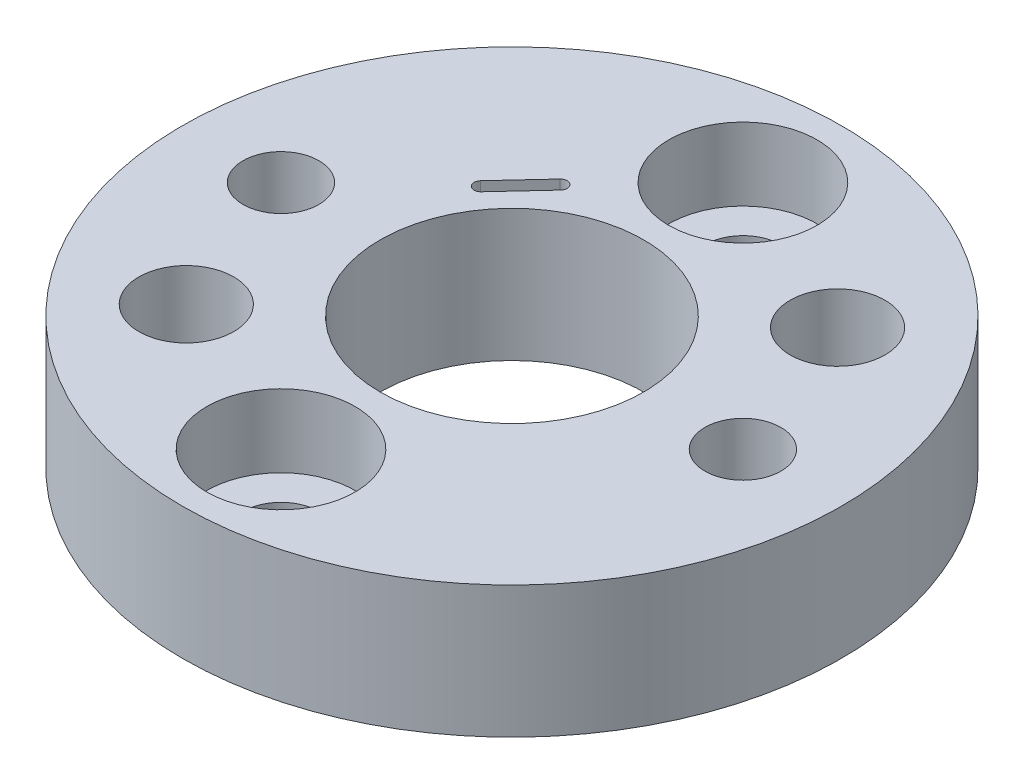
ISO-10303-21;
HEADER;
FILE_DESCRIPTION(('STEP AP214'),'2;1');
FILE_NAME('part.step','',(''),(''),'','','');
FILE_SCHEMA(('AUTOMOTIVE_DESIGN { 1 0 10303 214 1 1 1 1 }'));
ENDSEC;
DATA;
#1=APPLICATION_CONTEXT('core data for automotive mechanical design processes');
#2=APPLICATION_PROTOCOL_DEFINITION('international standard','automotive_design',2000,#1);
#3=PRODUCT_CONTEXT('',#1,'mechanical');
#4=PRODUCT('Part','Part','',(#3));
#5=PRODUCT_RELATED_PRODUCT_CATEGORY('part','',(#4));
#6=PRODUCT_DEFINITION_FORMATION('','',#4);
#7=PRODUCT_DEFINITION_CONTEXT('part definition',#1,'design');
#8=PRODUCT_DEFINITION('design','',#6,#7);
#9=PRODUCT_DEFINITION_SHAPE('','',#8);
#10=(LENGTH_UNIT() NAMED_UNIT(*) SI_UNIT(.MILLI.,.METRE.));
#11=(NAMED_UNIT(*) PLANE_ANGLE_UNIT() SI_UNIT($,.RADIAN.));
#12=(NAMED_UNIT(*) SI_UNIT($,.STERADIAN.) SOLID_ANGLE_UNIT());
#13=UNCERTAINTY_MEASURE_WITH_UNIT(LENGTH_MEASURE(1.E-05),#10,'distance_accuracy_value','');
#14=(GEOMETRIC_REPRESENTATION_CONTEXT(3) GLOBAL_UNCERTAINTY_ASSIGNED_CONTEXT((#13)) GLOBAL_UNIT_ASSIGNED_CONTEXT((#10,
#11,#12)) REPRESENTATION_CONTEXT('',''));
#15=CARTESIAN_POINT('',(0.,0.,0.));
#16=DIRECTION('',(0.,0.,1.));
#17=DIRECTION('',(1.,0.,0.));
#18=AXIS2_PLACEMENT_3D('',#15,#16,#17);
#19=CARTESIAN_POINT('',(0.,6.35,0.));
#20=DIRECTION('',(0.,1.,0.));
#21=DIRECTION('',(0.,0.,1.));
#22=AXIS2_PLACEMENT_3D('',#19,#20,#21);
#23=PLANE('',#22);
#24=CARTESIAN_POINT('',(-11.1252,6.34999999999999,0.));
#25=DIRECTION('',(0.,-1.,0.));
#26=DIRECTION('',(0.,0.,-1.));
#27=AXIS2_PLACEMENT_3D('',#24,#25,#26);
#28=CIRCLE('',#27,1.82880000000001);
#29=CARTESIAN_POINT('',(-11.1252,6.34999999999999,-1.82880000000001));
#30=VERTEX_POINT('',#29);
#31=EDGE_CURVE('E285',#30,#30,#28,.T.);
#32=ORIENTED_EDGE('',*,*,#31,.T.);
#33=EDGE_LOOP('',(#32));
#34=FACE_BOUND('',#33,.T.);
#35=CARTESIAN_POINT('',(0.,6.35,11.1252));
#36=DIRECTION('',(0.,1.,0.));
#37=DIRECTION('',(0.,0.,1.));
#38=AXIS2_PLACEMENT_3D('',#35,#36,#37);
#39=CIRCLE('',#38,3.57251);
#40=CARTESIAN_POINT('',(0.,6.35,14.69771));
#41=VERTEX_POINT('',#40);
#42=EDGE_CURVE('E288',#41,#41,#39,.T.);
#43=ORIENTED_EDGE('',*,*,#42,.F.);
#44=EDGE_LOOP('',(#43));
#45=FACE_BOUND('',#44,.T.);
#46=CARTESIAN_POINT('',(0.,6.35,-11.1252));
#47=DIRECTION('',(0.,1.,0.));
#48=DIRECTION('',(0.,0.,1.));
#49=AXIS2_PLACEMENT_3D('',#46,#47,#48);
#50=CIRCLE('',#49,3.57251);
#51=CARTESIAN_POINT('',(0.,6.35,-7.55269));
#52=VERTEX_POINT('',#51);
#53=EDGE_CURVE('E298',#52,#52,#50,.T.);
#54=ORIENTED_EDGE('',*,*,#53,.F.);
#55=EDGE_LOOP('',(#54));
#56=FACE_BOUND('',#55,.T.);
#57=CARTESIAN_POINT('',(11.1252,6.34999999999999,0.));
#58=DIRECTION('',(0.,-1.,0.));
#59=DIRECTION('',(0.,0.,-1.));
#60=AXIS2_PLACEMENT_3D('',#57,#58,#59);
#61=CIRCLE('',#60,1.82880000000001);
#62=CARTESIAN_POINT('',(11.1252,6.34999999999999,-1.82880000000001));
#63=VERTEX_POINT('',#62);
#64=EDGE_CURVE('E105',#63,#63,#61,.T.);
#65=ORIENTED_EDGE('',*,*,#64,.T.);
#66=EDGE_LOOP('',(#65));
#67=FACE_BOUND('',#66,.T.);
#68=CARTESIAN_POINT('',(-8.32891159723607,6.35,7.35641814033341));
#69=DIRECTION('',(0.,1.,0.));
#70=DIRECTION('',(0.,0.,-1.));
#71=AXIS2_PLACEMENT_3D('',#68,#69,#70);
#72=CIRCLE('',#71,2.286);
#73=CARTESIAN_POINT('',(-8.32891159723607,6.35,5.07041814033341));
#74=VERTEX_POINT('',#73);
#75=EDGE_CURVE('E94',#74,#74,#72,.T.);
#76=ORIENTED_EDGE('',*,*,#75,.F.);
#77=EDGE_LOOP('',(#76));
#78=FACE_BOUND('',#77,.T.);
#79=CARTESIAN_POINT('',(8.32891159723607,6.35,-7.35641814033341));
#80=DIRECTION('',(0.,1.,0.));
#81=DIRECTION('',(0.,0.,1.));
#82=AXIS2_PLACEMENT_3D('',#79,#80,#81);
#83=CIRCLE('',#82,2.286);
#84=CARTESIAN_POINT('',(8.32891159723607,6.35,-5.07041814033341));
#85=VERTEX_POINT('',#84);
#86=EDGE_CURVE('E119',#85,#85,#83,.T.);
#87=ORIENTED_EDGE('',*,*,#86,.F.);
#88=EDGE_LOOP('',(#87));
#89=FACE_BOUND('',#88,.T.);
#90=CARTESIAN_POINT('',(0.,6.35,0.));
#91=DIRECTION('',(0.,1.,0.));
#92=DIRECTION('',(0.,0.,1.));
#93=AXIS2_PLACEMENT_3D('',#90,#91,#92);
#94=CIRCLE('',#93,6.35);
#95=CARTESIAN_POINT('',(0.,6.35,6.35));
#96=VERTEX_POINT('',#95);
#97=EDGE_CURVE('E125',#96,#96,#94,.T.);
#98=ORIENTED_EDGE('',*,*,#97,.F.);
#99=EDGE_LOOP('',(#98));
#100=FACE_BOUND('',#99,.T.);
#101=CARTESIAN_POINT('',(0.,6.35,0.));
#102=DIRECTION('',(0.,1.,0.));
#103=DIRECTION('',(0.,0.,1.));
#104=AXIS2_PLACEMENT_3D('',#101,#102,#103);
#105=CIRCLE('',#104,15.875);
#106=CARTESIAN_POINT('',(0.,6.35,15.875));
#107=VERTEX_POINT('',#106);
#108=EDGE_CURVE('E11',#107,#107,#105,.T.);
#109=ORIENTED_EDGE('',*,*,#108,.T.);
#110=EDGE_LOOP('',(#109));
#111=FACE_BOUND('',#110,.T.);
#112=CARTESIAN_POINT('',(-6.15769241715111,6.35,-4.66085783906228));
#113=DIRECTION('',(0.,1.,0.));
#114=DIRECTION('',(0.,0.,1.));
#115=AXIS2_PLACEMENT_3D('',#112,#113,#114);
#116=CIRCLE('',#115,0.327254868180187);
#117=CARTESIAN_POINT('',(-6.39758263951138,6.35,-4.88345260531605));
#118=VERTEX_POINT('',#117);
#119=CARTESIAN_POINT('',(-5.91780219479084,6.35,-4.43826307280851));
#120=VERTEX_POINT('',#119);
#121=EDGE_CURVE('E87',#118,#120,#116,.T.);
#122=ORIENTED_EDGE('',*,*,#121,.F.);
#123=DIRECTION('',(0.680187792137623,0.,-0.733037903131172));
#124=VECTOR('',#123,1.);
#125=CARTESIAN_POINT('',(-6.39758263951138,6.35,-4.88345260531605));
#126=LINE('',#125,#124);
#127=CARTESIAN_POINT('',(-4.55415128901584,6.35,-6.87011726962409));
#128=VERTEX_POINT('',#127);
#129=EDGE_CURVE('E52',#118,#128,#126,.T.);
#130=ORIENTED_EDGE('',*,*,#129,.T.);
#131=CARTESIAN_POINT('',(-4.31426106665557,6.35,-6.64752250337032));
#132=DIRECTION('',(0.,1.,0.));
#133=DIRECTION('',(0.,0.,1.));
#134=AXIS2_PLACEMENT_3D('',#131,#132,#133);
#135=CIRCLE('',#134,0.327254868180187);
#136=CARTESIAN_POINT('',(-4.07437084429529,6.35,-6.42492773711655));
#137=VERTEX_POINT('',#136);
#138=EDGE_CURVE('E93',#137,#128,#135,.T.);
#139=ORIENTED_EDGE('',*,*,#138,.F.);
#140=DIRECTION('',(0.680187792137623,0.,-0.733037903131172));
#141=VECTOR('',#140,1.);
#142=CARTESIAN_POINT('',(-5.91780219479084,6.35,-4.43826307280851));
#143=LINE('',#142,#141);
#144=EDGE_CURVE('E107',#120,#137,#143,.T.);
#145=ORIENTED_EDGE('',*,*,#144,.F.);
#146=EDGE_LOOP('',(#122,#130,#139,#145));
#147=FACE_BOUND('',#146,.T.);
#148=ADVANCED_FACE('F37',(#34,#45,#56,#67,#78,#89,#100,#111,#147),#23,.T.);
#149=CARTESIAN_POINT('',(0.,0.,0.));
#150=DIRECTION('',(0.,1.,0.));
#151=DIRECTION('',(0.,0.,1.));
#152=AXIS2_PLACEMENT_3D('',#149,#150,#151);
#153=PLANE('',#152);
#154=CARTESIAN_POINT('',(-11.1252,0.,0.));
#155=DIRECTION('',(0.,-1.,0.));
#156=DIRECTION('',(0.,0.,-1.));
#157=AXIS2_PLACEMENT_3D('',#154,#155,#156);
#158=CIRCLE('',#157,3.57251);
#159=CARTESIAN_POINT('',(-11.1252,0.,-3.57251));
#160=VERTEX_POINT('',#159);
#161=EDGE_CURVE('E179',#160,#160,#158,.T.);
#162=ORIENTED_EDGE('',*,*,#161,.F.);
#163=EDGE_LOOP('',(#162));
#164=FACE_BOUND('',#163,.T.);
#165=CARTESIAN_POINT('',(0.,0.,11.1252));
#166=DIRECTION('',(0.,1.,0.));
#167=DIRECTION('',(0.,0.,1.));
#168=AXIS2_PLACEMENT_3D('',#165,#166,#167);
#169=CIRCLE('',#168,1.82880000000001);
#170=CARTESIAN_POINT('',(0.,0.,12.954));
#171=VERTEX_POINT('',#170);
#172=EDGE_CURVE('E183',#171,#171,#169,.T.);
#173=ORIENTED_EDGE('',*,*,#172,.T.);
#174=EDGE_LOOP('',(#173));
#175=FACE_BOUND('',#174,.T.);
#176=CARTESIAN_POINT('',(0.,0.,-11.1252));
#177=DIRECTION('',(0.,1.,0.));
#178=DIRECTION('',(0.,0.,1.));
#179=AXIS2_PLACEMENT_3D('',#176,#177,#178);
#180=CIRCLE('',#179,1.82880000000001);
#181=CARTESIAN_POINT('',(0.,0.,-9.29639999999999));
#182=VERTEX_POINT('',#181);
#183=EDGE_CURVE('E187',#182,#182,#180,.T.);
#184=ORIENTED_EDGE('',*,*,#183,.T.);
#185=EDGE_LOOP('',(#184));
#186=FACE_BOUND('',#185,.T.);
#187=CARTESIAN_POINT('',(11.1252,0.,0.));
#188=DIRECTION('',(0.,-1.,0.));
#189=DIRECTION('',(0.,0.,-1.));
#190=AXIS2_PLACEMENT_3D('',#187,#188,#189);
#191=CIRCLE('',#190,3.57251);
#192=CARTESIAN_POINT('',(11.1252,0.,-3.57251));
#193=VERTEX_POINT('',#192);
#194=EDGE_CURVE('E191',#193,#193,#191,.T.);
#195=ORIENTED_EDGE('',*,*,#194,.F.);
#196=EDGE_LOOP('',(#195));
#197=FACE_BOUND('',#196,.T.);
#198=CARTESIAN_POINT('',(0.,0.,0.));
#199=DIRECTION('',(0.,1.,0.));
#200=DIRECTION('',(0.,0.,1.));
#201=AXIS2_PLACEMENT_3D('',#198,#199,#200);
#202=CIRCLE('',#201,15.875);
#203=CARTESIAN_POINT('',(0.,0.,15.875));
#204=VERTEX_POINT('',#203);
#205=EDGE_CURVE('E41',#204,#204,#202,.T.);
#206=ORIENTED_EDGE('',*,*,#205,.F.);
#207=EDGE_LOOP('',(#206));
#208=FACE_BOUND('',#207,.T.);
#209=CARTESIAN_POINT('',(0.,0.,0.));
#210=DIRECTION('',(0.,1.,0.));
#211=DIRECTION('',(0.,0.,1.));
#212=AXIS2_PLACEMENT_3D('',#209,#210,#211);
#213=CIRCLE('',#212,6.35);
#214=CARTESIAN_POINT('',(0.,0.,6.35));
#215=VERTEX_POINT('',#214);
#216=EDGE_CURVE('E128',#215,#215,#213,.T.);
#217=ORIENTED_EDGE('',*,*,#216,.T.);
#218=EDGE_LOOP('',(#217));
#219=FACE_BOUND('',#218,.T.);
#220=CARTESIAN_POINT('',(8.32891159723607,0.,-7.35641814033341));
#221=DIRECTION('',(0.,1.,0.));
#222=DIRECTION('',(0.,0.,1.));
#223=AXIS2_PLACEMENT_3D('',#220,#221,#222);
#224=CIRCLE('',#223,2.286);
#225=CARTESIAN_POINT('',(8.32891159723607,0.,-5.07041814033341));
#226=VERTEX_POINT('',#225);
#227=EDGE_CURVE('E122',#226,#226,#224,.T.);
#228=ORIENTED_EDGE('',*,*,#227,.T.);
#229=EDGE_LOOP('',(#228));
#230=FACE_BOUND('',#229,.T.);
#231=CARTESIAN_POINT('',(-8.32891159723607,0.,7.35641814033341));
#232=DIRECTION('',(0.,1.,0.));
#233=DIRECTION('',(0.,0.,-1.));
#234=AXIS2_PLACEMENT_3D('',#231,#232,#233);
#235=CIRCLE('',#234,2.286);
#236=CARTESIAN_POINT('',(-8.32891159723607,0.,5.07041814033341));
#237=VERTEX_POINT('',#236);
#238=EDGE_CURVE('E116',#237,#237,#235,.T.);
#239=ORIENTED_EDGE('',*,*,#238,.T.);
#240=EDGE_LOOP('',(#239));
#241=FACE_BOUND('',#240,.T.);
#242=DIRECTION('',(0.680187792137623,0.,-0.733037903131172));
#243=VECTOR('',#242,1.);
#244=CARTESIAN_POINT('',(-6.39758263951138,0.,-4.88345260531605));
#245=LINE('',#244,#243);
#246=CARTESIAN_POINT('',(-6.39758263951138,0.,-4.88345260531605));
#247=VERTEX_POINT('',#246);
#248=CARTESIAN_POINT('',(-4.55415128901584,0.,-6.87011726962409));
#249=VERTEX_POINT('',#248);
#250=EDGE_CURVE('E76',#247,#249,#245,.T.);
#251=ORIENTED_EDGE('',*,*,#250,.F.);
#252=CARTESIAN_POINT('',(-6.15769241715111,0.,-4.66085783906228));
#253=DIRECTION('',(0.,1.,0.));
#254=DIRECTION('',(0.,0.,1.));
#255=AXIS2_PLACEMENT_3D('',#252,#253,#254);
#256=CIRCLE('',#255,0.327254868180187);
#257=CARTESIAN_POINT('',(-5.91780219479084,0.,-4.43826307280851));
#258=VERTEX_POINT('',#257);
#259=EDGE_CURVE('E99',#247,#258,#256,.T.);
#260=ORIENTED_EDGE('',*,*,#259,.T.);
#261=DIRECTION('',(0.680187792137623,0.,-0.733037903131172));
#262=VECTOR('',#261,1.);
#263=CARTESIAN_POINT('',(-5.91780219479084,0.,-4.43826307280851));
#264=LINE('',#263,#262);
#265=CARTESIAN_POINT('',(-4.07437084429529,0.,-6.42492773711655));
#266=VERTEX_POINT('',#265);
#267=EDGE_CURVE('E60',#258,#266,#264,.T.);
#268=ORIENTED_EDGE('',*,*,#267,.T.);
#269=CARTESIAN_POINT('',(-4.31426106665557,0.,-6.64752250337032));
#270=DIRECTION('',(0.,1.,0.));
#271=DIRECTION('',(0.,0.,1.));
#272=AXIS2_PLACEMENT_3D('',#269,#270,#271);
#273=CIRCLE('',#272,0.327254868180187);
#274=EDGE_CURVE('E86',#266,#249,#273,.T.);
#275=ORIENTED_EDGE('',*,*,#274,.T.);
#276=EDGE_LOOP('',(#251,#260,#268,#275));
#277=FACE_BOUND('',#276,.T.);
#278=ADVANCED_FACE('F97',(#164,#175,#186,#197,#208,#219,#230,#241,#277),#153,.F.);
#279=CARTESIAN_POINT('',(0.,6.35,0.));
#280=DIRECTION('',(0.,-1.,0.));
#281=DIRECTION('',(0.,0.,-1.));
#282=AXIS2_PLACEMENT_3D('',#279,#280,#281);
#283=CYLINDRICAL_SURFACE('',#282,15.875);
#284=ORIENTED_EDGE('',*,*,#108,.F.);
#285=EDGE_LOOP('',(#284));
#286=FACE_BOUND('',#285,.T.);
#287=ORIENTED_EDGE('',*,*,#205,.T.);
#288=EDGE_LOOP('',(#287));
#289=FACE_BOUND('',#288,.T.);
#290=ADVANCED_FACE('F39',(#286,#289),#283,.T.);
#291=CARTESIAN_POINT('',(0.,0.,0.));
#292=DIRECTION('',(0.,1.,0.));
#293=DIRECTION('',(0.,0.,1.));
#294=AXIS2_PLACEMENT_3D('',#291,#292,#293);
#295=CYLINDRICAL_SURFACE('',#294,6.35);
#296=ORIENTED_EDGE('',*,*,#216,.F.);
#297=EDGE_LOOP('',(#296));
#298=FACE_BOUND('',#297,.T.);
#299=ORIENTED_EDGE('',*,*,#97,.T.);
#300=EDGE_LOOP('',(#299));
#301=FACE_BOUND('',#300,.T.);
#302=ADVANCED_FACE('F134',(#298,#301),#295,.F.);
#303=CARTESIAN_POINT('',(8.32891159723607,0.,-7.35641814033341));
#304=DIRECTION('',(0.,1.,0.));
#305=DIRECTION('',(0.,0.,1.));
#306=AXIS2_PLACEMENT_3D('',#303,#304,#305);
#307=CYLINDRICAL_SURFACE('',#306,2.286);
#308=ORIENTED_EDGE('',*,*,#227,.F.);
#309=EDGE_LOOP('',(#308));
#310=FACE_BOUND('',#309,.T.);
#311=ORIENTED_EDGE('',*,*,#86,.T.);
#312=EDGE_LOOP('',(#311));
#313=FACE_BOUND('',#312,.T.);
#314=ADVANCED_FACE('F163',(#310,#313),#307,.F.);
#315=CARTESIAN_POINT('',(-8.32891159723607,0.,7.35641814033341));
#316=DIRECTION('',(0.,1.,0.));
#317=DIRECTION('',(0.,0.,1.));
#318=AXIS2_PLACEMENT_3D('',#315,#316,#317);
#319=CYLINDRICAL_SURFACE('',#318,2.286);
#320=ORIENTED_EDGE('',*,*,#238,.F.);
#321=EDGE_LOOP('',(#320));
#322=FACE_BOUND('',#321,.T.);
#323=ORIENTED_EDGE('',*,*,#75,.T.);
#324=EDGE_LOOP('',(#323));
#325=FACE_BOUND('',#324,.T.);
#326=ADVANCED_FACE('F160',(#322,#325),#319,.F.);
#327=CARTESIAN_POINT('',(-6.39758263951138,0.,-4.88345260531605));
#328=DIRECTION('',(0.733037903131172,0.,0.680187792137623));
#329=DIRECTION('',(0.680187792137623,0.,-0.733037903131172));
#330=AXIS2_PLACEMENT_3D('',#327,#328,#329);
#331=PLANE('',#330);
#332=ORIENTED_EDGE('',*,*,#129,.F.);
#333=DIRECTION('',(0.,1.,0.));
#334=VECTOR('',#333,1.);
#335=CARTESIAN_POINT('',(-6.39758263951138,0.,-4.88345260531605));
#336=LINE('',#335,#334);
#337=EDGE_CURVE('E81',#247,#118,#336,.T.);
#338=ORIENTED_EDGE('',*,*,#337,.F.);
#339=ORIENTED_EDGE('',*,*,#250,.T.);
#340=DIRECTION('',(0.,1.,0.));
#341=VECTOR('',#340,1.);
#342=CARTESIAN_POINT('',(-4.55415128901584,0.,-6.87011726962409));
#343=LINE('',#342,#341);
#344=EDGE_CURVE('E79',#249,#128,#343,.T.);
#345=ORIENTED_EDGE('',*,*,#344,.T.);
#346=EDGE_LOOP('',(#332,#338,#339,#345));
#347=FACE_BOUND('',#346,.T.);
#348=ADVANCED_FACE('F78',(#347),#331,.T.);
#349=CARTESIAN_POINT('',(-4.31426106665557,0.,-6.64752250337032));
#350=DIRECTION('',(0.,1.,0.));
#351=DIRECTION('',(0.,0.,1.));
#352=AXIS2_PLACEMENT_3D('',#349,#350,#351);
#353=CYLINDRICAL_SURFACE('',#352,0.327254868180187);
#354=ORIENTED_EDGE('',*,*,#138,.T.);
#355=ORIENTED_EDGE('',*,*,#344,.F.);
#356=ORIENTED_EDGE('',*,*,#274,.F.);
#357=DIRECTION('',(0.,1.,0.));
#358=VECTOR('',#357,1.);
#359=CARTESIAN_POINT('',(-4.07437084429529,0.,-6.42492773711655));
#360=LINE('',#359,#358);
#361=EDGE_CURVE('E95',#266,#137,#360,.T.);
#362=ORIENTED_EDGE('',*,*,#361,.T.);
#363=EDGE_LOOP('',(#354,#355,#356,#362));
#364=FACE_BOUND('',#363,.T.);
#365=ADVANCED_FACE('F91',(#364),#353,.F.);
#366=CARTESIAN_POINT('',(-5.91780219479084,0.,-4.43826307280851));
#367=DIRECTION('',(0.733037903131172,0.,0.680187792137623));
#368=DIRECTION('',(0.680187792137623,0.,-0.733037903131172));
#369=AXIS2_PLACEMENT_3D('',#366,#367,#368);
#370=PLANE('',#369);
#371=ORIENTED_EDGE('',*,*,#144,.T.);
#372=ORIENTED_EDGE('',*,*,#361,.F.);
#373=ORIENTED_EDGE('',*,*,#267,.F.);
#374=DIRECTION('',(0.,1.,0.));
#375=VECTOR('',#374,1.);
#376=CARTESIAN_POINT('',(-5.91780219479084,0.,-4.43826307280851));
#377=LINE('',#376,#375);
#378=EDGE_CURVE('E113',#258,#120,#377,.T.);
#379=ORIENTED_EDGE('',*,*,#378,.T.);
#380=EDGE_LOOP('',(#371,#372,#373,#379));
#381=FACE_BOUND('',#380,.T.);
#382=ADVANCED_FACE('F146',(#381),#370,.F.);
#383=CARTESIAN_POINT('',(-6.15769241715111,0.,-4.66085783906228));
#384=DIRECTION('',(0.,1.,0.));
#385=DIRECTION('',(0.,0.,1.));
#386=AXIS2_PLACEMENT_3D('',#383,#384,#385);
#387=CYLINDRICAL_SURFACE('',#386,0.327254868180187);
#388=ORIENTED_EDGE('',*,*,#121,.T.);
#389=ORIENTED_EDGE('',*,*,#378,.F.);
#390=ORIENTED_EDGE('',*,*,#259,.F.);
#391=ORIENTED_EDGE('',*,*,#337,.T.);
#392=EDGE_LOOP('',(#388,#389,#390,#391));
#393=FACE_BOUND('',#392,.T.);
#394=ADVANCED_FACE('F145',(#393),#387,.F.);
#395=CARTESIAN_POINT('',(11.1252,0.,0.));
#396=DIRECTION('',(0.,-1.,0.));
#397=DIRECTION('',(0.,0.,-1.));
#398=AXIS2_PLACEMENT_3D('',#395,#396,#397);
#399=CYLINDRICAL_SURFACE('',#398,1.8288);
#400=ORIENTED_EDGE('',*,*,#64,.F.);
#401=EDGE_LOOP('',(#400));
#402=FACE_BOUND('',#401,.T.);
#403=CARTESIAN_POINT('',(11.1252,3.5052,0.));
#404=DIRECTION('',(0.,-1.,0.));
#405=DIRECTION('',(0.,0.,-1.));
#406=AXIS2_PLACEMENT_3D('',#403,#404,#405);
#407=CIRCLE('',#406,1.8288);
#408=CARTESIAN_POINT('',(11.1252,3.5052,-1.8288));
#409=VERTEX_POINT('',#408);
#410=EDGE_CURVE('E211',#409,#409,#407,.T.);
#411=ORIENTED_EDGE('',*,*,#410,.T.);
#412=EDGE_LOOP('',(#411));
#413=FACE_BOUND('',#412,.T.);
#414=ADVANCED_FACE('F153',(#402,#413),#399,.F.);
#415=CARTESIAN_POINT('',(12.954,3.5052,0.));
#416=DIRECTION('',(0.,1.,0.));
#417=DIRECTION('',(0.,0.,1.));
#418=AXIS2_PLACEMENT_3D('',#415,#416,#417);
#419=PLANE('',#418);
#420=ORIENTED_EDGE('',*,*,#410,.F.);
#421=EDGE_LOOP('',(#420));
#422=FACE_BOUND('',#421,.T.);
#423=CARTESIAN_POINT('',(11.1252,3.5052,0.));
#424=DIRECTION('',(0.,-1.,0.));
#425=DIRECTION('',(0.,0.,-1.));
#426=AXIS2_PLACEMENT_3D('',#423,#424,#425);
#427=CIRCLE('',#426,3.57251);
#428=CARTESIAN_POINT('',(11.1252,3.5052,-3.57251));
#429=VERTEX_POINT('',#428);
#430=EDGE_CURVE('E208',#429,#429,#427,.T.);
#431=ORIENTED_EDGE('',*,*,#430,.T.);
#432=EDGE_LOOP('',(#431));
#433=FACE_BOUND('',#432,.T.);
#434=ADVANCED_FACE('F224',(#422,#433),#419,.F.);
#435=CARTESIAN_POINT('',(11.1252,0.,0.));
#436=DIRECTION('',(0.,-1.,0.));
#437=DIRECTION('',(0.,0.,-1.));
#438=AXIS2_PLACEMENT_3D('',#435,#436,#437);
#439=CYLINDRICAL_SURFACE('',#438,3.57251);
#440=ORIENTED_EDGE('',*,*,#430,.F.);
#441=EDGE_LOOP('',(#440));
#442=FACE_BOUND('',#441,.T.);
#443=ORIENTED_EDGE('',*,*,#194,.T.);
#444=EDGE_LOOP('',(#443));
#445=FACE_BOUND('',#444,.T.);
#446=ADVANCED_FACE('F229',(#442,#445),#439,.F.);
#447=CARTESIAN_POINT('',(0.,6.35,-11.1252));
#448=DIRECTION('',(0.,1.,0.));
#449=DIRECTION('',(0.,0.,1.));
#450=AXIS2_PLACEMENT_3D('',#447,#448,#449);
#451=CYLINDRICAL_SURFACE('',#450,1.8288);
#452=ORIENTED_EDGE('',*,*,#183,.F.);
#453=EDGE_LOOP('',(#452));
#454=FACE_BOUND('',#453,.T.);
#455=CARTESIAN_POINT('',(0.,2.8448,-11.1252));
#456=DIRECTION('',(0.,1.,0.));
#457=DIRECTION('',(0.,0.,1.));
#458=AXIS2_PLACEMENT_3D('',#455,#456,#457);
#459=CIRCLE('',#458,1.8288);
#460=CARTESIAN_POINT('',(0.,2.8448,-9.2964));
#461=VERTEX_POINT('',#460);
#462=EDGE_CURVE('E213',#461,#461,#459,.T.);
#463=ORIENTED_EDGE('',*,*,#462,.T.);
#464=EDGE_LOOP('',(#463));
#465=FACE_BOUND('',#464,.T.);
#466=ADVANCED_FACE('F234',(#454,#465),#451,.F.);
#467=CARTESIAN_POINT('',(1.8288,2.8448,-11.1252));
#468=DIRECTION('',(0.,-1.,0.));
#469=DIRECTION('',(0.,0.,-1.));
#470=AXIS2_PLACEMENT_3D('',#467,#468,#469);
#471=PLANE('',#470);
#472=ORIENTED_EDGE('',*,*,#462,.F.);
#473=EDGE_LOOP('',(#472));
#474=FACE_BOUND('',#473,.T.);
#475=CARTESIAN_POINT('',(0.,2.8448,-11.1252));
#476=DIRECTION('',(0.,1.,0.));
#477=DIRECTION('',(0.,0.,1.));
#478=AXIS2_PLACEMENT_3D('',#475,#476,#477);
#479=CIRCLE('',#478,3.57251);
#480=CARTESIAN_POINT('',(0.,2.8448,-7.55269));
#481=VERTEX_POINT('',#480);
#482=EDGE_CURVE('E301',#481,#481,#479,.T.);
#483=ORIENTED_EDGE('',*,*,#482,.T.);
#484=EDGE_LOOP('',(#483));
#485=FACE_BOUND('',#484,.T.);
#486=ADVANCED_FACE('F239',(#474,#485),#471,.F.);
#487=CARTESIAN_POINT('',(0.,6.35,-11.1252));
#488=DIRECTION('',(0.,1.,0.));
#489=DIRECTION('',(0.,0.,1.));
#490=AXIS2_PLACEMENT_3D('',#487,#488,#489);
#491=CYLINDRICAL_SURFACE('',#490,3.57251);
#492=ORIENTED_EDGE('',*,*,#482,.F.);
#493=EDGE_LOOP('',(#492));
#494=FACE_BOUND('',#493,.T.);
#495=ORIENTED_EDGE('',*,*,#53,.T.);
#496=EDGE_LOOP('',(#495));
#497=FACE_BOUND('',#496,.T.);
#498=ADVANCED_FACE('F245',(#494,#497),#491,.F.);
#499=CARTESIAN_POINT('',(0.,6.35,11.1252));
#500=DIRECTION('',(0.,1.,0.));
#501=DIRECTION('',(0.,0.,1.));
#502=AXIS2_PLACEMENT_3D('',#499,#500,#501);
#503=CYLINDRICAL_SURFACE('',#502,1.8288);
#504=ORIENTED_EDGE('',*,*,#172,.F.);
#505=EDGE_LOOP('',(#504));
#506=FACE_BOUND('',#505,.T.);
#507=CARTESIAN_POINT('',(0.,2.8448,11.1252));
#508=DIRECTION('',(0.,1.,0.));
#509=DIRECTION('',(0.,0.,1.));
#510=AXIS2_PLACEMENT_3D('',#507,#508,#509);
#511=CIRCLE('',#510,1.8288);
#512=CARTESIAN_POINT('',(0.,2.8448,12.954));
#513=VERTEX_POINT('',#512);
#514=EDGE_CURVE('E294',#513,#513,#511,.T.);
#515=ORIENTED_EDGE('',*,*,#514,.T.);
#516=EDGE_LOOP('',(#515));
#517=FACE_BOUND('',#516,.T.);
#518=ADVANCED_FACE('F249',(#506,#517),#503,.F.);
#519=CARTESIAN_POINT('',(1.8288,2.8448,11.1252));
#520=DIRECTION('',(0.,-1.,0.));
#521=DIRECTION('',(0.,0.,-1.));
#522=AXIS2_PLACEMENT_3D('',#519,#520,#521);
#523=PLANE('',#522);
#524=ORIENTED_EDGE('',*,*,#514,.F.);
#525=EDGE_LOOP('',(#524));
#526=FACE_BOUND('',#525,.T.);
#527=CARTESIAN_POINT('',(0.,2.8448,11.1252));
#528=DIRECTION('',(0.,1.,0.));
#529=DIRECTION('',(0.,0.,1.));
#530=AXIS2_PLACEMENT_3D('',#527,#528,#529);
#531=CIRCLE('',#530,3.57251);
#532=CARTESIAN_POINT('',(0.,2.8448,14.69771));
#533=VERTEX_POINT('',#532);
#534=EDGE_CURVE('E291',#533,#533,#531,.T.);
#535=ORIENTED_EDGE('',*,*,#534,.T.);
#536=EDGE_LOOP('',(#535));
#537=FACE_BOUND('',#536,.T.);
#538=ADVANCED_FACE('F253',(#526,#537),#523,.F.);
#539=CARTESIAN_POINT('',(0.,6.35,11.1252));
#540=DIRECTION('',(0.,1.,0.));
#541=DIRECTION('',(0.,0.,1.));
#542=AXIS2_PLACEMENT_3D('',#539,#540,#541);
#543=CYLINDRICAL_SURFACE('',#542,3.57251);
#544=ORIENTED_EDGE('',*,*,#534,.F.);
#545=EDGE_LOOP('',(#544));
#546=FACE_BOUND('',#545,.T.);
#547=ORIENTED_EDGE('',*,*,#42,.T.);
#548=EDGE_LOOP('',(#547));
#549=FACE_BOUND('',#548,.T.);
#550=ADVANCED_FACE('F257',(#546,#549),#543,.F.);
#551=CARTESIAN_POINT('',(-11.1252,0.,0.));
#552=DIRECTION('',(0.,-1.,0.));
#553=DIRECTION('',(0.,0.,-1.));
#554=AXIS2_PLACEMENT_3D('',#551,#552,#553);
#555=CYLINDRICAL_SURFACE('',#554,1.8288);
#556=ORIENTED_EDGE('',*,*,#31,.F.);
#557=EDGE_LOOP('',(#556));
#558=FACE_BOUND('',#557,.T.);
#559=CARTESIAN_POINT('',(-11.1252,3.5052,0.));
#560=DIRECTION('',(0.,-1.,0.));
#561=DIRECTION('',(0.,0.,-1.));
#562=AXIS2_PLACEMENT_3D('',#559,#560,#561);
#563=CIRCLE('',#562,1.8288);
#564=CARTESIAN_POINT('',(-11.1252,3.5052,-1.8288));
#565=VERTEX_POINT('',#564);
#566=EDGE_CURVE('E280',#565,#565,#563,.T.);
#567=ORIENTED_EDGE('',*,*,#566,.T.);
#568=EDGE_LOOP('',(#567));
#569=FACE_BOUND('',#568,.T.);
#570=ADVANCED_FACE('F261',(#558,#569),#555,.F.);
#571=CARTESIAN_POINT('',(-9.2964,3.5052,0.));
#572=DIRECTION('',(0.,1.,0.));
#573=DIRECTION('',(0.,0.,1.));
#574=AXIS2_PLACEMENT_3D('',#571,#572,#573);
#575=PLANE('',#574);
#576=ORIENTED_EDGE('',*,*,#566,.F.);
#577=EDGE_LOOP('',(#576));
#578=FACE_BOUND('',#577,.T.);
#579=CARTESIAN_POINT('',(-11.1252,3.5052,0.));
#580=DIRECTION('',(0.,-1.,0.));
#581=DIRECTION('',(0.,0.,-1.));
#582=AXIS2_PLACEMENT_3D('',#579,#580,#581);
#583=CIRCLE('',#582,3.57251);
#584=CARTESIAN_POINT('',(-11.1252,3.5052,-3.57251));
#585=VERTEX_POINT('',#584);
#586=EDGE_CURVE('E278',#585,#585,#583,.T.);
#587=ORIENTED_EDGE('',*,*,#586,.T.);
#588=EDGE_LOOP('',(#587));
#589=FACE_BOUND('',#588,.T.);
#590=ADVANCED_FACE('F265',(#578,#589),#575,.F.);
#591=CARTESIAN_POINT('',(-11.1252,0.,0.));
#592=DIRECTION('',(0.,-1.,0.));
#593=DIRECTION('',(0.,0.,-1.));
#594=AXIS2_PLACEMENT_3D('',#591,#592,#593);
#595=CYLINDRICAL_SURFACE('',#594,3.57251);
#596=ORIENTED_EDGE('',*,*,#586,.F.);
#597=EDGE_LOOP('',(#596));
#598=FACE_BOUND('',#597,.T.);
#599=ORIENTED_EDGE('',*,*,#161,.T.);
#600=EDGE_LOOP('',(#599));
#601=FACE_BOUND('',#600,.T.);
#602=ADVANCED_FACE('F269',(#598,#601),#595,.F.);
#603=CLOSED_SHELL('',(#148,#278,#290,#302,#314,#326,#348,#365,#382,#394,#414,#434,#446,#466,
#486,#498,#518,#538,#550,#570,#590,#602));
#604=MANIFOLD_SOLID_BREP('B2',#603);
#605=ADVANCED_BREP_SHAPE_REPRESENTATION('',(#18,#604),#14);
#606=SHAPE_DEFINITION_REPRESENTATION(#9,#605);
ENDSEC;
END-ISO-10303-21;
